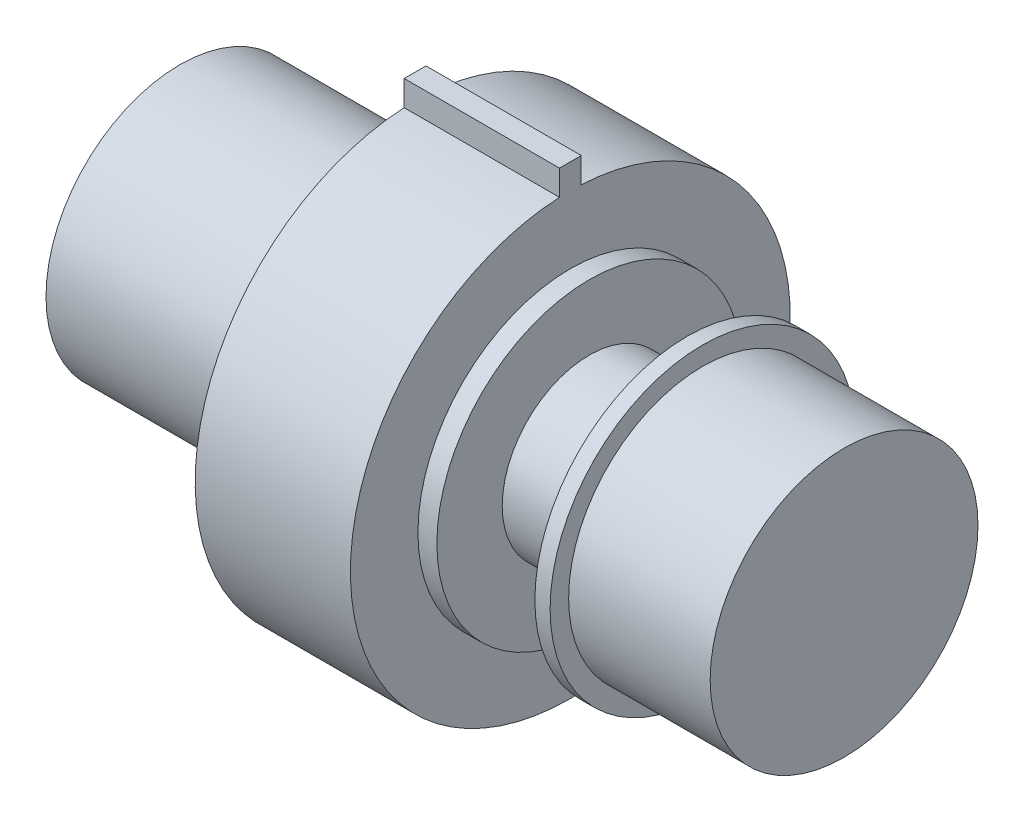
ISO-10303-21;
HEADER;
FILE_DESCRIPTION(('STEP AP214'),'2;1');
FILE_NAME('part.step','',(''),(''),'','','');
FILE_SCHEMA(('AUTOMOTIVE_DESIGN { 1 0 10303 214 1 1 1 1 }'));
ENDSEC;
DATA;
#1=APPLICATION_CONTEXT('core data for automotive mechanical design processes');
#2=APPLICATION_PROTOCOL_DEFINITION('international standard','automotive_design',2000,#1);
#3=PRODUCT_CONTEXT('',#1,'mechanical');
#4=PRODUCT('Part','Part','',(#3));
#5=PRODUCT_RELATED_PRODUCT_CATEGORY('part','',(#4));
#6=PRODUCT_DEFINITION_FORMATION('','',#4);
#7=PRODUCT_DEFINITION_CONTEXT('part definition',#1,'design');
#8=PRODUCT_DEFINITION('design','',#6,#7);
#9=PRODUCT_DEFINITION_SHAPE('','',#8);
#10=(LENGTH_UNIT() NAMED_UNIT(*) SI_UNIT(.MILLI.,.METRE.));
#11=(NAMED_UNIT(*) PLANE_ANGLE_UNIT() SI_UNIT($,.RADIAN.));
#12=(NAMED_UNIT(*) SI_UNIT($,.STERADIAN.) SOLID_ANGLE_UNIT());
#13=UNCERTAINTY_MEASURE_WITH_UNIT(LENGTH_MEASURE(1.E-05),#10,'distance_accuracy_value','');
#14=(GEOMETRIC_REPRESENTATION_CONTEXT(3) GLOBAL_UNCERTAINTY_ASSIGNED_CONTEXT((#13)) GLOBAL_UNIT_ASSIGNED_CONTEXT((#10,
#11,#12)) REPRESENTATION_CONTEXT('',''));
#15=CARTESIAN_POINT('',(0.,0.,0.));
#16=DIRECTION('',(0.,0.,1.));
#17=DIRECTION('',(1.,0.,0.));
#18=AXIS2_PLACEMENT_3D('',#15,#16,#17);
#19=CARTESIAN_POINT('',(26.8,101.,0.));
#20=DIRECTION('',(-1.,0.,0.));
#21=DIRECTION('',(0.,0.,1.));
#22=AXIS2_PLACEMENT_3D('',#19,#20,#21);
#23=PLANE('',#22);
#24=DIRECTION('',(0.,-1.,0.));
#25=VECTOR('',#24,1.);
#26=CARTESIAN_POINT('',(26.8,77.5,5.));
#27=LINE('',#26,#25);
#28=CARTESIAN_POINT('',(26.8,112.5,5.));
#29=VERTEX_POINT('',#28);
#30=CARTESIAN_POINT('',(26.7999999999999,100.876161703348,5.));
#31=VERTEX_POINT('',#30);
#32=EDGE_CURVE('E84',#29,#31,#27,.T.);
#33=ORIENTED_EDGE('',*,*,#32,.T.);
#34=CARTESIAN_POINT('',(26.7999999999999,0.,0.));
#35=DIRECTION('',(-1.,0.,0.));
#36=DIRECTION('',(0.,0.,1.));
#37=AXIS2_PLACEMENT_3D('',#34,#35,#36);
#38=CIRCLE('',#37,101.);
#39=CARTESIAN_POINT('',(26.7999999999999,100.876161703348,-5.));
#40=VERTEX_POINT('',#39);
#41=EDGE_CURVE('E11',#40,#31,#38,.T.);
#42=ORIENTED_EDGE('',*,*,#41,.F.);
#43=DIRECTION('',(0.,1.,0.));
#44=VECTOR('',#43,1.);
#45=CARTESIAN_POINT('',(26.8,77.5,-5.));
#46=LINE('',#45,#44);
#47=CARTESIAN_POINT('',(26.8,112.5,-5.));
#48=VERTEX_POINT('',#47);
#49=EDGE_CURVE('E97',#40,#48,#46,.T.);
#50=ORIENTED_EDGE('',*,*,#49,.T.);
#51=DIRECTION('',(0.,0.,1.));
#52=VECTOR('',#51,1.);
#53=CARTESIAN_POINT('',(26.8,112.5,-5.));
#54=LINE('',#53,#52);
#55=EDGE_CURVE('E99',#48,#29,#54,.T.);
#56=ORIENTED_EDGE('',*,*,#55,.T.);
#57=EDGE_LOOP('',(#33,#42,#50,#56));
#58=FACE_BOUND('',#57,.T.);
#59=CARTESIAN_POINT('',(26.7999999999999,0.,0.));
#60=DIRECTION('',(-1.,0.,0.));
#61=DIRECTION('',(0.,0.,1.));
#62=AXIS2_PLACEMENT_3D('',#59,#60,#61);
#63=CIRCLE('',#62,70.);
#64=CARTESIAN_POINT('',(26.7999999999999,0.,70.));
#65=VERTEX_POINT('',#64);
#66=EDGE_CURVE('E105',#65,#65,#63,.T.);
#67=ORIENTED_EDGE('',*,*,#66,.T.);
#68=EDGE_LOOP('',(#67));
#69=FACE_BOUND('',#68,.T.);
#70=ADVANCED_FACE('F35',(#58,#69),#23,.F.);
#71=CARTESIAN_POINT('',(-1716.32432220827,0.,0.));
#72=DIRECTION('',(-1.,0.,0.));
#73=DIRECTION('',(0.,0.,1.));
#74=AXIS2_PLACEMENT_3D('',#71,#72,#73);
#75=CYLINDRICAL_SURFACE('',#74,101.);
#76=ORIENTED_EDGE('',*,*,#41,.T.);
#77=DIRECTION('',(-1.,0.,0.));
#78=VECTOR('',#77,1.);
#79=CARTESIAN_POINT('',(-1716.32432220827,100.876161703348,5.));
#80=LINE('',#79,#78);
#81=CARTESIAN_POINT('',(-44.5,100.876161703348,5.));
#82=VERTEX_POINT('',#81);
#83=EDGE_CURVE('E103',#31,#82,#80,.T.);
#84=ORIENTED_EDGE('',*,*,#83,.T.);
#85=CARTESIAN_POINT('',(-44.5,0.,0.));
#86=DIRECTION('',(-1.,0.,0.));
#87=DIRECTION('',(0.,0.,1.));
#88=AXIS2_PLACEMENT_3D('',#85,#86,#87);
#89=CIRCLE('',#88,101.);
#90=CARTESIAN_POINT('',(-44.5,100.876161703348,-5.));
#91=VERTEX_POINT('',#90);
#92=EDGE_CURVE('E42',#91,#82,#89,.T.);
#93=ORIENTED_EDGE('',*,*,#92,.F.);
#94=DIRECTION('',(-1.,0.,0.));
#95=VECTOR('',#94,1.);
#96=CARTESIAN_POINT('',(-1716.32432220827,100.876161703348,-5.));
#97=LINE('',#96,#95);
#98=EDGE_CURVE('E101',#91,#40,#97,.F.);
#99=ORIENTED_EDGE('',*,*,#98,.T.);
#100=EDGE_LOOP('',(#76,#84,#93,#99));
#101=FACE_BOUND('',#100,.T.);
#102=ADVANCED_FACE('F139',(#101),#75,.T.);
#103=CARTESIAN_POINT('',(-44.5,61.5,0.));
#104=DIRECTION('',(1.,0.,0.));
#105=DIRECTION('',(0.,0.,-1.));
#106=AXIS2_PLACEMENT_3D('',#103,#104,#105);
#107=PLANE('',#106);
#108=CARTESIAN_POINT('',(-44.5,0.,0.));
#109=DIRECTION('',(-1.,0.,0.));
#110=DIRECTION('',(0.,0.,1.));
#111=AXIS2_PLACEMENT_3D('',#108,#109,#110);
#112=CIRCLE('',#111,61.5);
#113=CARTESIAN_POINT('',(-44.5,0.,61.5));
#114=VERTEX_POINT('',#113);
#115=EDGE_CURVE('E132',#114,#114,#112,.T.);
#116=ORIENTED_EDGE('',*,*,#115,.F.);
#117=EDGE_LOOP('',(#116));
#118=FACE_BOUND('',#117,.T.);
#119=ORIENTED_EDGE('',*,*,#92,.T.);
#120=DIRECTION('',(0.,1.,0.));
#121=VECTOR('',#120,1.);
#122=CARTESIAN_POINT('',(-44.5,77.5,5.));
#123=LINE('',#122,#121);
#124=CARTESIAN_POINT('',(-44.5,112.5,5.));
#125=VERTEX_POINT('',#124);
#126=EDGE_CURVE('E71',#82,#125,#123,.T.);
#127=ORIENTED_EDGE('',*,*,#126,.T.);
#128=DIRECTION('',(0.,0.,-1.));
#129=VECTOR('',#128,1.);
#130=CARTESIAN_POINT('',(-44.5,112.5,-5.));
#131=LINE('',#130,#129);
#132=CARTESIAN_POINT('',(-44.5,112.5,-5.));
#133=VERTEX_POINT('',#132);
#134=EDGE_CURVE('E76',#125,#133,#131,.T.);
#135=ORIENTED_EDGE('',*,*,#134,.T.);
#136=DIRECTION('',(0.,-1.,0.));
#137=VECTOR('',#136,1.);
#138=CARTESIAN_POINT('',(-44.5,77.5,-5.));
#139=LINE('',#138,#137);
#140=EDGE_CURVE('E88',#133,#91,#139,.T.);
#141=ORIENTED_EDGE('',*,*,#140,.T.);
#142=EDGE_LOOP('',(#119,#127,#135,#141));
#143=FACE_BOUND('',#142,.T.);
#144=ADVANCED_FACE('F73',(#118,#143),#107,.F.);
#145=CARTESIAN_POINT('',(-1716.32432220827,0.,0.));
#146=DIRECTION('',(-1.,0.,0.));
#147=DIRECTION('',(0.,0.,1.));
#148=AXIS2_PLACEMENT_3D('',#145,#146,#147);
#149=CYLINDRICAL_SURFACE('',#148,61.5);
#150=CARTESIAN_POINT('',(-152.5,0.,0.));
#151=DIRECTION('',(-1.,0.,0.));
#152=DIRECTION('',(0.,0.,1.));
#153=AXIS2_PLACEMENT_3D('',#150,#151,#152);
#154=CIRCLE('',#153,61.5);
#155=CARTESIAN_POINT('',(-152.5,0.,61.5));
#156=VERTEX_POINT('',#155);
#157=EDGE_CURVE('E129',#156,#156,#154,.T.);
#158=ORIENTED_EDGE('',*,*,#157,.F.);
#159=EDGE_LOOP('',(#158));
#160=FACE_BOUND('',#159,.T.);
#161=ORIENTED_EDGE('',*,*,#115,.T.);
#162=EDGE_LOOP('',(#161));
#163=FACE_BOUND('',#162,.T.);
#164=ADVANCED_FACE('F136',(#160,#163),#149,.T.);
#165=CARTESIAN_POINT('',(-152.5,0.,0.));
#166=DIRECTION('',(1.,0.,0.));
#167=DIRECTION('',(0.,0.,-1.));
#168=AXIS2_PLACEMENT_3D('',#165,#166,#167);
#169=PLANE('',#168);
#170=ORIENTED_EDGE('',*,*,#157,.T.);
#171=EDGE_LOOP('',(#170));
#172=FACE_BOUND('',#171,.T.);
#173=ADVANCED_FACE('F145',(#172),#169,.F.);
#174=CARTESIAN_POINT('',(152.5,0.,0.));
#175=DIRECTION('',(-1.,0.,0.));
#176=DIRECTION('',(0.,0.,1.));
#177=AXIS2_PLACEMENT_3D('',#174,#175,#176);
#178=PLANE('',#177);
#179=CARTESIAN_POINT('',(152.5,0.,0.));
#180=DIRECTION('',(-1.,0.,0.));
#181=DIRECTION('',(0.,0.,1.));
#182=AXIS2_PLACEMENT_3D('',#179,#180,#181);
#183=CIRCLE('',#182,61.5);
#184=CARTESIAN_POINT('',(152.5,0.,61.5));
#185=VERTEX_POINT('',#184);
#186=EDGE_CURVE('E126',#185,#185,#183,.T.);
#187=ORIENTED_EDGE('',*,*,#186,.F.);
#188=EDGE_LOOP('',(#187));
#189=FACE_BOUND('',#188,.T.);
#190=ADVANCED_FACE('F194',(#189),#178,.F.);
#191=CARTESIAN_POINT('',(-1716.32432220827,0.,0.));
#192=DIRECTION('',(-1.,0.,0.));
#193=DIRECTION('',(0.,0.,1.));
#194=AXIS2_PLACEMENT_3D('',#191,#192,#193);
#195=CYLINDRICAL_SURFACE('',#194,61.5);
#196=CARTESIAN_POINT('',(87.4999999999999,0.,0.));
#197=DIRECTION('',(-1.,0.,0.));
#198=DIRECTION('',(0.,0.,1.));
#199=AXIS2_PLACEMENT_3D('',#196,#197,#198);
#200=CIRCLE('',#199,61.5);
#201=CARTESIAN_POINT('',(87.4999999999999,0.,61.5));
#202=VERTEX_POINT('',#201);
#203=EDGE_CURVE('E123',#202,#202,#200,.T.);
#204=ORIENTED_EDGE('',*,*,#203,.F.);
#205=EDGE_LOOP('',(#204));
#206=FACE_BOUND('',#205,.T.);
#207=ORIENTED_EDGE('',*,*,#186,.T.);
#208=EDGE_LOOP('',(#207));
#209=FACE_BOUND('',#208,.T.);
#210=ADVANCED_FACE('F188',(#206,#209),#195,.T.);
#211=CARTESIAN_POINT('',(87.5,70.,0.));
#212=DIRECTION('',(-1.,0.,0.));
#213=DIRECTION('',(0.,0.,1.));
#214=AXIS2_PLACEMENT_3D('',#211,#212,#213);
#215=PLANE('',#214);
#216=CARTESIAN_POINT('',(87.4999999999999,0.,0.));
#217=DIRECTION('',(-1.,0.,0.));
#218=DIRECTION('',(0.,0.,1.));
#219=AXIS2_PLACEMENT_3D('',#216,#217,#218);
#220=CIRCLE('',#219,70.);
#221=CARTESIAN_POINT('',(87.4999999999999,0.,70.));
#222=VERTEX_POINT('',#221);
#223=EDGE_CURVE('E120',#222,#222,#220,.T.);
#224=ORIENTED_EDGE('',*,*,#223,.F.);
#225=EDGE_LOOP('',(#224));
#226=FACE_BOUND('',#225,.T.);
#227=ORIENTED_EDGE('',*,*,#203,.T.);
#228=EDGE_LOOP('',(#227));
#229=FACE_BOUND('',#228,.T.);
#230=ADVANCED_FACE('F182',(#226,#229),#215,.F.);
#231=CARTESIAN_POINT('',(-1716.32432220827,0.,0.));
#232=DIRECTION('',(-1.,0.,0.));
#233=DIRECTION('',(0.,0.,1.));
#234=AXIS2_PLACEMENT_3D('',#231,#232,#233);
#235=CYLINDRICAL_SURFACE('',#234,70.);
#236=CARTESIAN_POINT('',(80.5,0.,0.));
#237=DIRECTION('',(-1.,0.,0.));
#238=DIRECTION('',(0.,0.,1.));
#239=AXIS2_PLACEMENT_3D('',#236,#237,#238);
#240=CIRCLE('',#239,70.);
#241=CARTESIAN_POINT('',(80.5,0.,70.));
#242=VERTEX_POINT('',#241);
#243=EDGE_CURVE('E117',#242,#242,#240,.T.);
#244=ORIENTED_EDGE('',*,*,#243,.F.);
#245=EDGE_LOOP('',(#244));
#246=FACE_BOUND('',#245,.T.);
#247=ORIENTED_EDGE('',*,*,#223,.T.);
#248=EDGE_LOOP('',(#247));
#249=FACE_BOUND('',#248,.T.);
#250=ADVANCED_FACE('F176',(#246,#249),#235,.T.);
#251=CARTESIAN_POINT('',(80.5,40.,0.));
#252=DIRECTION('',(1.,0.,0.));
#253=DIRECTION('',(0.,0.,-1.));
#254=AXIS2_PLACEMENT_3D('',#251,#252,#253);
#255=PLANE('',#254);
#256=CARTESIAN_POINT('',(80.5,0.,0.));
#257=DIRECTION('',(-1.,0.,0.));
#258=DIRECTION('',(0.,0.,1.));
#259=AXIS2_PLACEMENT_3D('',#256,#257,#258);
#260=CIRCLE('',#259,40.);
#261=CARTESIAN_POINT('',(80.5,0.,40.));
#262=VERTEX_POINT('',#261);
#263=EDGE_CURVE('E114',#262,#262,#260,.T.);
#264=ORIENTED_EDGE('',*,*,#263,.F.);
#265=EDGE_LOOP('',(#264));
#266=FACE_BOUND('',#265,.T.);
#267=ORIENTED_EDGE('',*,*,#243,.T.);
#268=EDGE_LOOP('',(#267));
#269=FACE_BOUND('',#268,.T.);
#270=ADVANCED_FACE('F170',(#266,#269),#255,.F.);
#271=CARTESIAN_POINT('',(-1716.32432220827,0.,0.));
#272=DIRECTION('',(-1.,0.,0.));
#273=DIRECTION('',(0.,0.,1.));
#274=AXIS2_PLACEMENT_3D('',#271,#272,#273);
#275=CYLINDRICAL_SURFACE('',#274,40.);
#276=CARTESIAN_POINT('',(35.5000000000001,0.,0.));
#277=DIRECTION('',(-1.,0.,0.));
#278=DIRECTION('',(0.,0.,1.));
#279=AXIS2_PLACEMENT_3D('',#276,#277,#278);
#280=CIRCLE('',#279,40.);
#281=CARTESIAN_POINT('',(35.5000000000001,0.,40.));
#282=VERTEX_POINT('',#281);
#283=EDGE_CURVE('E111',#282,#282,#280,.T.);
#284=ORIENTED_EDGE('',*,*,#283,.F.);
#285=EDGE_LOOP('',(#284));
#286=FACE_BOUND('',#285,.T.);
#287=ORIENTED_EDGE('',*,*,#263,.T.);
#288=EDGE_LOOP('',(#287));
#289=FACE_BOUND('',#288,.T.);
#290=ADVANCED_FACE('F164',(#286,#289),#275,.T.);
#291=CARTESIAN_POINT('',(35.5,70.,0.));
#292=DIRECTION('',(-1.,0.,0.));
#293=DIRECTION('',(0.,0.,1.));
#294=AXIS2_PLACEMENT_3D('',#291,#292,#293);
#295=PLANE('',#294);
#296=CARTESIAN_POINT('',(35.5000000000001,0.,0.));
#297=DIRECTION('',(-1.,0.,0.));
#298=DIRECTION('',(0.,0.,1.));
#299=AXIS2_PLACEMENT_3D('',#296,#297,#298);
#300=CIRCLE('',#299,70.);
#301=CARTESIAN_POINT('',(35.5000000000001,0.,70.));
#302=VERTEX_POINT('',#301);
#303=EDGE_CURVE('E108',#302,#302,#300,.T.);
#304=ORIENTED_EDGE('',*,*,#303,.F.);
#305=EDGE_LOOP('',(#304));
#306=FACE_BOUND('',#305,.T.);
#307=ORIENTED_EDGE('',*,*,#283,.T.);
#308=EDGE_LOOP('',(#307));
#309=FACE_BOUND('',#308,.T.);
#310=ADVANCED_FACE('F158',(#306,#309),#295,.F.);
#311=CARTESIAN_POINT('',(-1716.32432220827,0.,0.));
#312=DIRECTION('',(-1.,0.,0.));
#313=DIRECTION('',(0.,0.,1.));
#314=AXIS2_PLACEMENT_3D('',#311,#312,#313);
#315=CYLINDRICAL_SURFACE('',#314,70.);
#316=ORIENTED_EDGE('',*,*,#66,.F.);
#317=EDGE_LOOP('',(#316));
#318=FACE_BOUND('',#317,.T.);
#319=ORIENTED_EDGE('',*,*,#303,.T.);
#320=EDGE_LOOP('',(#319));
#321=FACE_BOUND('',#320,.T.);
#322=ADVANCED_FACE('F155',(#318,#321),#315,.T.);
#323=CARTESIAN_POINT('',(63.2005494464026,77.5,5.));
#324=DIRECTION('',(0.,0.,1.));
#325=DIRECTION('',(1.,0.,0.));
#326=AXIS2_PLACEMENT_3D('',#323,#324,#325);
#327=PLANE('',#326);
#328=ORIENTED_EDGE('',*,*,#83,.F.);
#329=ORIENTED_EDGE('',*,*,#32,.F.);
#330=DIRECTION('',(-1.,0.,0.));
#331=VECTOR('',#330,1.);
#332=CARTESIAN_POINT('',(63.2005494464026,112.5,5.));
#333=LINE('',#332,#331);
#334=EDGE_CURVE('E81',#29,#125,#333,.T.);
#335=ORIENTED_EDGE('',*,*,#334,.T.);
#336=ORIENTED_EDGE('',*,*,#126,.F.);
#337=EDGE_LOOP('',(#328,#329,#335,#336));
#338=FACE_BOUND('',#337,.T.);
#339=ADVANCED_FACE('F82',(#338),#327,.T.);
#340=CARTESIAN_POINT('',(63.2005494464026,77.5,-5.));
#341=DIRECTION('',(0.,0.,-1.));
#342=DIRECTION('',(-1.,0.,0.));
#343=AXIS2_PLACEMENT_3D('',#340,#341,#342);
#344=PLANE('',#343);
#345=ORIENTED_EDGE('',*,*,#98,.F.);
#346=ORIENTED_EDGE('',*,*,#140,.F.);
#347=DIRECTION('',(-1.,0.,0.));
#348=VECTOR('',#347,1.);
#349=CARTESIAN_POINT('',(63.2005494464026,112.5,-5.));
#350=LINE('',#349,#348);
#351=EDGE_CURVE('E87',#48,#133,#350,.T.);
#352=ORIENTED_EDGE('',*,*,#351,.F.);
#353=ORIENTED_EDGE('',*,*,#49,.F.);
#354=EDGE_LOOP('',(#345,#346,#352,#353));
#355=FACE_BOUND('',#354,.T.);
#356=ADVANCED_FACE('F208',(#355),#344,.T.);
#357=CARTESIAN_POINT('',(63.2005494464026,112.5,-5.));
#358=DIRECTION('',(0.,1.,0.));
#359=DIRECTION('',(0.,0.,1.));
#360=AXIS2_PLACEMENT_3D('',#357,#358,#359);
#361=PLANE('',#360);
#362=ORIENTED_EDGE('',*,*,#55,.F.);
#363=ORIENTED_EDGE('',*,*,#351,.T.);
#364=ORIENTED_EDGE('',*,*,#134,.F.);
#365=ORIENTED_EDGE('',*,*,#334,.F.);
#366=EDGE_LOOP('',(#362,#363,#364,#365));
#367=FACE_BOUND('',#366,.T.);
#368=ADVANCED_FACE('F90',(#367),#361,.T.);
#369=CLOSED_SHELL('',(#70,#102,#144,#164,#173,#190,#210,#230,#250,#270,#290,#310,#322,#339,#356,#368));
#370=MANIFOLD_SOLID_BREP('B2',#369);
#371=ADVANCED_BREP_SHAPE_REPRESENTATION('',(#18,#370),#14);
#372=SHAPE_DEFINITION_REPRESENTATION(#9,#371);
ENDSEC;
END-ISO-10303-21;
